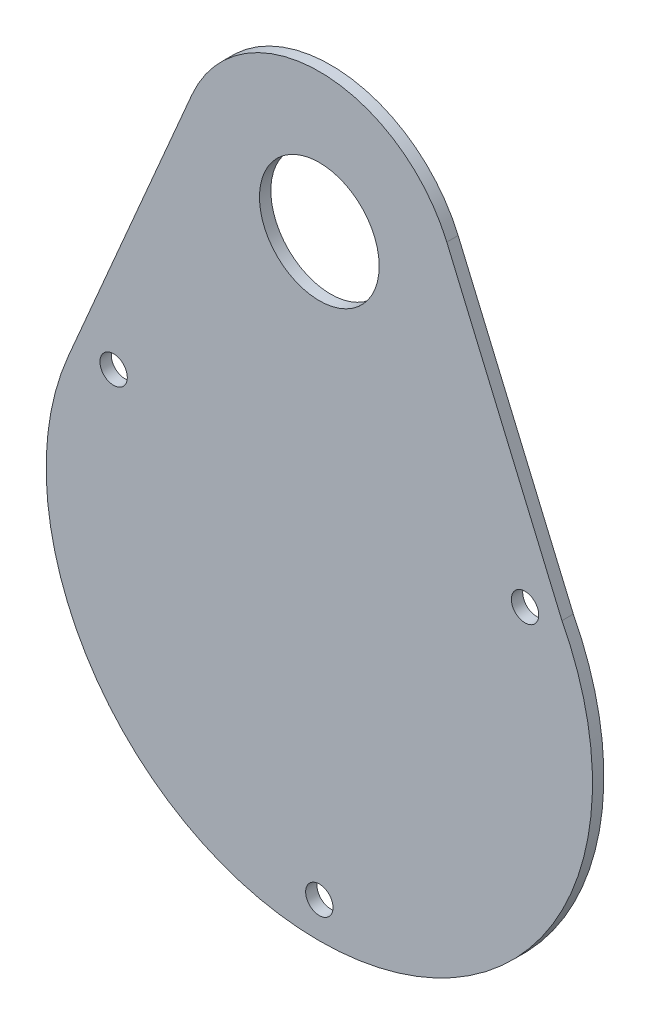
ISO-10303-21;
HEADER;
FILE_DESCRIPTION(('STEP AP214'),'2;1');
FILE_NAME('part.step','',(''),(''),'','','');
FILE_SCHEMA(('AUTOMOTIVE_DESIGN { 1 0 10303 214 1 1 1 1 }'));
ENDSEC;
DATA;
#1=APPLICATION_CONTEXT('core data for automotive mechanical design processes');
#2=APPLICATION_PROTOCOL_DEFINITION('international standard','automotive_design',2000,#1);
#3=PRODUCT_CONTEXT('',#1,'mechanical');
#4=PRODUCT('Part','Part','',(#3));
#5=PRODUCT_RELATED_PRODUCT_CATEGORY('part','',(#4));
#6=PRODUCT_DEFINITION_FORMATION('','',#4);
#7=PRODUCT_DEFINITION_CONTEXT('part definition',#1,'design');
#8=PRODUCT_DEFINITION('design','',#6,#7);
#9=PRODUCT_DEFINITION_SHAPE('','',#8);
#10=(LENGTH_UNIT() NAMED_UNIT(*) SI_UNIT(.MILLI.,.METRE.));
#11=(NAMED_UNIT(*) PLANE_ANGLE_UNIT() SI_UNIT($,.RADIAN.));
#12=(NAMED_UNIT(*) SI_UNIT($,.STERADIAN.) SOLID_ANGLE_UNIT());
#13=UNCERTAINTY_MEASURE_WITH_UNIT(LENGTH_MEASURE(1.E-05),#10,'distance_accuracy_value','');
#14=(GEOMETRIC_REPRESENTATION_CONTEXT(3) GLOBAL_UNCERTAINTY_ASSIGNED_CONTEXT((#13)) GLOBAL_UNIT_ASSIGNED_CONTEXT((#10,
#11,#12)) REPRESENTATION_CONTEXT('',''));
#15=CARTESIAN_POINT('',(0.,0.,0.));
#16=DIRECTION('',(0.,0.,1.));
#17=DIRECTION('',(1.,0.,0.));
#18=AXIS2_PLACEMENT_3D('',#15,#16,#17);
#19=CARTESIAN_POINT('',(-78.7539641813405,33.7827181089703,1.51892));
#20=DIRECTION('',(0.91901391883388,-0.394225084170952,0.));
#21=DIRECTION('',(0.394225084170952,0.91901391883388,0.));
#22=AXIS2_PLACEMENT_3D('',#19,#20,#21);
#23=PLANE('',#22);
#24=DIRECTION('',(-0.394225084170952,-0.91901391883388,0.));
#25=VECTOR('',#24,1.);
#26=CARTESIAN_POINT('',(-78.7539641813405,33.7827181089703,0.));
#27=LINE('',#26,#25);
#28=CARTESIAN_POINT('',(-60.7106734926978,75.8450727135589,0.));
#29=VERTEX_POINT('',#28);
#30=CARTESIAN_POINT('',(-77.2285148054366,37.3388317741836,0.));
#31=VERTEX_POINT('',#30);
#32=EDGE_CURVE('E110',#29,#31,#27,.T.);
#33=ORIENTED_EDGE('',*,*,#32,.T.);
#34=DIRECTION('',(0.,0.,-1.));
#35=VECTOR('',#34,1.);
#36=CARTESIAN_POINT('',(-77.2285148054366,37.3388317741836,1.51892));
#37=LINE('',#36,#35);
#38=CARTESIAN_POINT('',(-77.2285148054366,37.3388317741836,1.51892));
#39=VERTEX_POINT('',#38);
#40=EDGE_CURVE('E11',#39,#31,#37,.T.);
#41=ORIENTED_EDGE('',*,*,#40,.F.);
#42=DIRECTION('',(-0.394225084170952,-0.91901391883388,0.));
#43=VECTOR('',#42,1.);
#44=CARTESIAN_POINT('',(-78.7539641813405,33.7827181089703,1.51892));
#45=LINE('',#44,#43);
#46=CARTESIAN_POINT('',(-60.7106734926978,75.8450727135589,1.51892));
#47=VERTEX_POINT('',#46);
#48=EDGE_CURVE('E83',#47,#39,#45,.T.);
#49=ORIENTED_EDGE('',*,*,#48,.F.);
#50=DIRECTION('',(0.,0.,-1.));
#51=VECTOR('',#50,1.);
#52=CARTESIAN_POINT('',(-60.7106734926978,75.8450727135589,1.51892));
#53=LINE('',#52,#51);
#54=EDGE_CURVE('E109',#47,#29,#53,.T.);
#55=ORIENTED_EDGE('',*,*,#54,.T.);
#56=EDGE_LOOP('',(#33,#41,#49,#55));
#57=FACE_BOUND('',#56,.T.);
#58=ADVANCED_FACE('F35',(#57),#23,.F.);
#59=CARTESIAN_POINT('',(-43.67356049616,22.9449206311271,1.51892));
#60=DIRECTION('',(0.,0.,-1.));
#61=DIRECTION('',(-1.,0.,0.));
#62=AXIS2_PLACEMENT_3D('',#59,#60,#61);
#63=CYLINDRICAL_SURFACE('',#62,36.5119108880387);
#64=CARTESIAN_POINT('',(-43.67356049616,22.9449206311271,0.));
#65=DIRECTION('',(0.,0.,1.));
#66=DIRECTION('',(1.,0.,0.));
#67=AXIS2_PLACEMENT_3D('',#64,#65,#66);
#68=CIRCLE('',#67,36.5119108880387);
#69=CARTESIAN_POINT('',(-11.243869286491,39.7209381781303,0.));
#70=VERTEX_POINT('',#69);
#71=EDGE_CURVE('E88',#31,#70,#68,.T.);
#72=ORIENTED_EDGE('',*,*,#71,.T.);
#73=DIRECTION('',(0.,0.,-1.));
#74=VECTOR('',#73,1.);
#75=CARTESIAN_POINT('',(-11.243869286491,39.7209381781303,1.51892));
#76=LINE('',#75,#74);
#77=CARTESIAN_POINT('',(-11.243869286491,39.7209381781303,1.51892));
#78=VERTEX_POINT('',#77);
#79=EDGE_CURVE('E43',#78,#70,#76,.T.);
#80=ORIENTED_EDGE('',*,*,#79,.F.);
#81=CARTESIAN_POINT('',(-43.67356049616,22.9449206311271,1.51892));
#82=DIRECTION('',(0.,0.,1.));
#83=DIRECTION('',(1.,0.,0.));
#84=AXIS2_PLACEMENT_3D('',#81,#82,#83);
#85=CIRCLE('',#84,36.5119108880387);
#86=EDGE_CURVE('E77',#39,#78,#85,.T.);
#87=ORIENTED_EDGE('',*,*,#86,.F.);
#88=ORIENTED_EDGE('',*,*,#40,.T.);
#89=EDGE_LOOP('',(#72,#80,#87,#88));
#90=FACE_BOUND('',#89,.T.);
#91=ADVANCED_FACE('F87',(#90),#63,.T.);
#92=CARTESIAN_POINT('',(4.80830424966438,2.04882968649571,1.51892));
#93=DIRECTION('',(0.91996545818209,0.391999433356501,0.));
#94=DIRECTION('',(-0.391999433356501,0.91996545818209,0.));
#95=AXIS2_PLACEMENT_3D('',#92,#93,#94);
#96=PLANE('',#95);
#97=DIRECTION('',(0.391999433356501,-0.91996545818209,0.));
#98=VECTOR('',#97,1.);
#99=CARTESIAN_POINT('',(4.80830424966438,2.04882968649571,0.));
#100=LINE('',#99,#98);
#101=CARTESIAN_POINT('',(-26.6364474996341,75.8450727136048,0.));
#102=VERTEX_POINT('',#101);
#103=EDGE_CURVE('E114',#102,#70,#100,.T.);
#104=ORIENTED_EDGE('',*,*,#103,.F.);
#105=DIRECTION('',(0.,0.,-1.));
#106=VECTOR('',#105,1.);
#107=CARTESIAN_POINT('',(-26.6364474996341,75.8450727136048,1.51892));
#108=LINE('',#107,#106);
#109=CARTESIAN_POINT('',(-26.6364474996341,75.8450727136048,1.51892));
#110=VERTEX_POINT('',#109);
#111=EDGE_CURVE('E67',#110,#102,#108,.T.);
#112=ORIENTED_EDGE('',*,*,#111,.F.);
#113=DIRECTION('',(0.391999433356501,-0.91996545818209,0.));
#114=VECTOR('',#113,1.);
#115=CARTESIAN_POINT('',(4.80830424966438,2.04882968649571,1.51892));
#116=LINE('',#115,#114);
#117=EDGE_CURVE('E81',#110,#78,#116,.T.);
#118=ORIENTED_EDGE('',*,*,#117,.T.);
#119=ORIENTED_EDGE('',*,*,#79,.T.);
#120=EDGE_LOOP('',(#104,#112,#118,#119));
#121=FACE_BOUND('',#120,.T.);
#122=ADVANCED_FACE('F92',(#121),#96,.T.);
#123=CARTESIAN_POINT('',(-71.1698670663794,38.8187423745676,1.51892));
#124=DIRECTION('',(0.,0.,-1.));
#125=DIRECTION('',(-1.,0.,0.));
#126=AXIS2_PLACEMENT_3D('',#123,#124,#125);
#127=CYLINDRICAL_SURFACE('',#126,1.82880000000001);
#128=CARTESIAN_POINT('',(-71.1698670663794,38.8187423745676,1.51892));
#129=DIRECTION('',(0.,0.,1.));
#130=DIRECTION('',(1.,0.,0.));
#131=AXIS2_PLACEMENT_3D('',#128,#129,#130);
#132=CIRCLE('',#131,1.82880000000001);
#133=CARTESIAN_POINT('',(-69.3410670663794,38.8187423745676,1.51892));
#134=VERTEX_POINT('',#133);
#135=EDGE_CURVE('E103',#134,#134,#132,.T.);
#136=ORIENTED_EDGE('',*,*,#135,.T.);
#137=EDGE_LOOP('',(#136));
#138=FACE_BOUND('',#137,.T.);
#139=CARTESIAN_POINT('',(-71.1698670663794,38.8187423745676,0.));
#140=DIRECTION('',(0.,0.,1.));
#141=DIRECTION('',(1.,0.,0.));
#142=AXIS2_PLACEMENT_3D('',#139,#140,#141);
#143=CIRCLE('',#142,1.82880000000001);
#144=CARTESIAN_POINT('',(-69.3410670663794,38.8187423745676,0.));
#145=VERTEX_POINT('',#144);
#146=EDGE_CURVE('E123',#145,#145,#143,.T.);
#147=ORIENTED_EDGE('',*,*,#146,.F.);
#148=EDGE_LOOP('',(#147));
#149=FACE_BOUND('',#148,.T.);
#150=ADVANCED_FACE('F165',(#138,#149),#127,.F.);
#151=CARTESIAN_POINT('',(-43.67356049616,-8.80625762550947,1.51892));
#152=DIRECTION('',(0.,0.,-1.));
#153=DIRECTION('',(-1.,0.,0.));
#154=AXIS2_PLACEMENT_3D('',#151,#152,#153);
#155=CYLINDRICAL_SURFACE('',#154,1.82879999996175);
#156=CARTESIAN_POINT('',(-43.67356049616,-8.80625762550947,1.51892));
#157=DIRECTION('',(0.,0.,1.));
#158=DIRECTION('',(1.,0.,0.));
#159=AXIS2_PLACEMENT_3D('',#156,#157,#158);
#160=CIRCLE('',#159,1.82879999996175);
#161=CARTESIAN_POINT('',(-41.8447604961983,-8.80625762550947,1.51892));
#162=VERTEX_POINT('',#161);
#163=EDGE_CURVE('E100',#162,#162,#160,.T.);
#164=ORIENTED_EDGE('',*,*,#163,.T.);
#165=EDGE_LOOP('',(#164));
#166=FACE_BOUND('',#165,.T.);
#167=CARTESIAN_POINT('',(-43.67356049616,-8.80625762550947,0.));
#168=DIRECTION('',(0.,0.,1.));
#169=DIRECTION('',(1.,0.,0.));
#170=AXIS2_PLACEMENT_3D('',#167,#168,#169);
#171=CIRCLE('',#170,1.82879999996175);
#172=CARTESIAN_POINT('',(-41.8447604961983,-8.80625762550947,0.));
#173=VERTEX_POINT('',#172);
#174=EDGE_CURVE('E120',#173,#173,#171,.T.);
#175=ORIENTED_EDGE('',*,*,#174,.F.);
#176=EDGE_LOOP('',(#175));
#177=FACE_BOUND('',#176,.T.);
#178=ADVANCED_FACE('F170',(#166,#177),#155,.F.);
#179=CARTESIAN_POINT('',(-16.1772539262865,38.8187423744684,1.51892));
#180=DIRECTION('',(0.,0.,-1.));
#181=DIRECTION('',(-1.,0.,0.));
#182=AXIS2_PLACEMENT_3D('',#179,#180,#181);
#183=CYLINDRICAL_SURFACE('',#182,1.82880000023833);
#184=CARTESIAN_POINT('',(-16.1772539262865,38.8187423744684,1.51892));
#185=DIRECTION('',(0.,0.,1.));
#186=DIRECTION('',(1.,0.,0.));
#187=AXIS2_PLACEMENT_3D('',#184,#185,#186);
#188=CIRCLE('',#187,1.82880000023833);
#189=CARTESIAN_POINT('',(-14.3484539260482,38.8187423744684,1.51892));
#190=VERTEX_POINT('',#189);
#191=EDGE_CURVE('E94',#190,#190,#188,.T.);
#192=ORIENTED_EDGE('',*,*,#191,.T.);
#193=EDGE_LOOP('',(#192));
#194=FACE_BOUND('',#193,.T.);
#195=CARTESIAN_POINT('',(-16.1772539262865,38.8187423744684,0.));
#196=DIRECTION('',(0.,0.,1.));
#197=DIRECTION('',(1.,0.,0.));
#198=AXIS2_PLACEMENT_3D('',#195,#196,#197);
#199=CIRCLE('',#198,1.82880000023833);
#200=CARTESIAN_POINT('',(-14.3484539260482,38.8187423744684,0.));
#201=VERTEX_POINT('',#200);
#202=EDGE_CURVE('E117',#201,#201,#199,.T.);
#203=ORIENTED_EDGE('',*,*,#202,.F.);
#204=EDGE_LOOP('',(#203));
#205=FACE_BOUND('',#204,.T.);
#206=ADVANCED_FACE('F155',(#194,#205),#183,.F.);
#207=CARTESIAN_POINT('',(-43.6735604961594,68.5367423744354,1.51892));
#208=DIRECTION('',(0.,0.,-1.));
#209=DIRECTION('',(-1.,0.,0.));
#210=AXIS2_PLACEMENT_3D('',#207,#208,#209);
#211=CYLINDRICAL_SURFACE('',#210,18.5384711236484);
#212=CARTESIAN_POINT('',(-43.6735604961594,68.5367423744354,0.));
#213=DIRECTION('',(0.,0.,1.));
#214=DIRECTION('',(1.,0.,0.));
#215=AXIS2_PLACEMENT_3D('',#212,#213,#214);
#216=CIRCLE('',#215,18.5384711236484);
#217=EDGE_CURVE('E70',#102,#29,#216,.T.);
#218=ORIENTED_EDGE('',*,*,#217,.T.);
#219=ORIENTED_EDGE('',*,*,#54,.F.);
#220=CARTESIAN_POINT('',(-43.6735604961594,68.5367423744354,1.51892));
#221=DIRECTION('',(0.,0.,1.));
#222=DIRECTION('',(1.,0.,0.));
#223=AXIS2_PLACEMENT_3D('',#220,#221,#222);
#224=CIRCLE('',#223,18.5384711236484);
#225=EDGE_CURVE('E51',#110,#47,#224,.T.);
#226=ORIENTED_EDGE('',*,*,#225,.F.);
#227=ORIENTED_EDGE('',*,*,#111,.T.);
#228=EDGE_LOOP('',(#218,#219,#226,#227));
#229=FACE_BOUND('',#228,.T.);
#230=ADVANCED_FACE('F147',(#229),#211,.T.);
#231=CARTESIAN_POINT('',(-43.6735604961594,68.5367423744354,1.51892));
#232=DIRECTION('',(0.,0.,-1.));
#233=DIRECTION('',(-1.,0.,0.));
#234=AXIS2_PLACEMENT_3D('',#231,#232,#233);
#235=CYLINDRICAL_SURFACE('',#234,8.001);
#236=CARTESIAN_POINT('',(-43.6735604961594,68.5367423744354,1.51892));
#237=DIRECTION('',(0.,0.,1.));
#238=DIRECTION('',(1.,0.,0.));
#239=AXIS2_PLACEMENT_3D('',#236,#237,#238);
#240=CIRCLE('',#239,8.001);
#241=CARTESIAN_POINT('',(-35.6725604961594,68.5367423744354,1.51892));
#242=VERTEX_POINT('',#241);
#243=EDGE_CURVE('E106',#242,#242,#240,.T.);
#244=ORIENTED_EDGE('',*,*,#243,.T.);
#245=EDGE_LOOP('',(#244));
#246=FACE_BOUND('',#245,.T.);
#247=CARTESIAN_POINT('',(-43.6735604961594,68.5367423744354,0.));
#248=DIRECTION('',(0.,0.,1.));
#249=DIRECTION('',(1.,0.,0.));
#250=AXIS2_PLACEMENT_3D('',#247,#248,#249);
#251=CIRCLE('',#250,8.001);
#252=CARTESIAN_POINT('',(-35.6725604961594,68.5367423744354,0.));
#253=VERTEX_POINT('',#252);
#254=EDGE_CURVE('E126',#253,#253,#251,.T.);
#255=ORIENTED_EDGE('',*,*,#254,.F.);
#256=EDGE_LOOP('',(#255));
#257=FACE_BOUND('',#256,.T.);
#258=ADVANCED_FACE('F145',(#246,#257),#235,.F.);
#259=CARTESIAN_POINT('',(0.,0.,1.51892));
#260=DIRECTION('',(0.,0.,1.));
#261=DIRECTION('',(1.,0.,0.));
#262=AXIS2_PLACEMENT_3D('',#259,#260,#261);
#263=PLANE('',#262);
#264=ORIENTED_EDGE('',*,*,#48,.T.);
#265=ORIENTED_EDGE('',*,*,#86,.T.);
#266=ORIENTED_EDGE('',*,*,#117,.F.);
#267=ORIENTED_EDGE('',*,*,#225,.T.);
#268=EDGE_LOOP('',(#264,#265,#266,#267));
#269=FACE_BOUND('',#268,.T.);
#270=ORIENTED_EDGE('',*,*,#191,.F.);
#271=EDGE_LOOP('',(#270));
#272=FACE_BOUND('',#271,.T.);
#273=ORIENTED_EDGE('',*,*,#163,.F.);
#274=EDGE_LOOP('',(#273));
#275=FACE_BOUND('',#274,.T.);
#276=ORIENTED_EDGE('',*,*,#135,.F.);
#277=EDGE_LOOP('',(#276));
#278=FACE_BOUND('',#277,.T.);
#279=ORIENTED_EDGE('',*,*,#243,.F.);
#280=EDGE_LOOP('',(#279));
#281=FACE_BOUND('',#280,.T.);
#282=ADVANCED_FACE('F78',(#269,#272,#275,#278,#281),#263,.T.);
#283=CARTESIAN_POINT('',(0.,0.,0.));
#284=DIRECTION('',(0.,0.,1.));
#285=DIRECTION('',(1.,0.,0.));
#286=AXIS2_PLACEMENT_3D('',#283,#284,#285);
#287=PLANE('',#286);
#288=ORIENTED_EDGE('',*,*,#32,.F.);
#289=ORIENTED_EDGE('',*,*,#217,.F.);
#290=ORIENTED_EDGE('',*,*,#103,.T.);
#291=ORIENTED_EDGE('',*,*,#71,.F.);
#292=EDGE_LOOP('',(#288,#289,#290,#291));
#293=FACE_BOUND('',#292,.T.);
#294=ORIENTED_EDGE('',*,*,#202,.T.);
#295=EDGE_LOOP('',(#294));
#296=FACE_BOUND('',#295,.T.);
#297=ORIENTED_EDGE('',*,*,#174,.T.);
#298=EDGE_LOOP('',(#297));
#299=FACE_BOUND('',#298,.T.);
#300=ORIENTED_EDGE('',*,*,#146,.T.);
#301=EDGE_LOOP('',(#300));
#302=FACE_BOUND('',#301,.T.);
#303=ORIENTED_EDGE('',*,*,#254,.T.);
#304=EDGE_LOOP('',(#303));
#305=FACE_BOUND('',#304,.T.);
#306=ADVANCED_FACE('F133',(#293,#296,#299,#302,#305),#287,.F.);
#307=CLOSED_SHELL('',(#58,#91,#122,#150,#178,#206,#230,#258,#282,#306));
#308=MANIFOLD_SOLID_BREP('B2',#307);
#309=ADVANCED_BREP_SHAPE_REPRESENTATION('',(#18,#308),#14);
#310=SHAPE_DEFINITION_REPRESENTATION(#9,#309);
ENDSEC;
END-ISO-10303-21;
